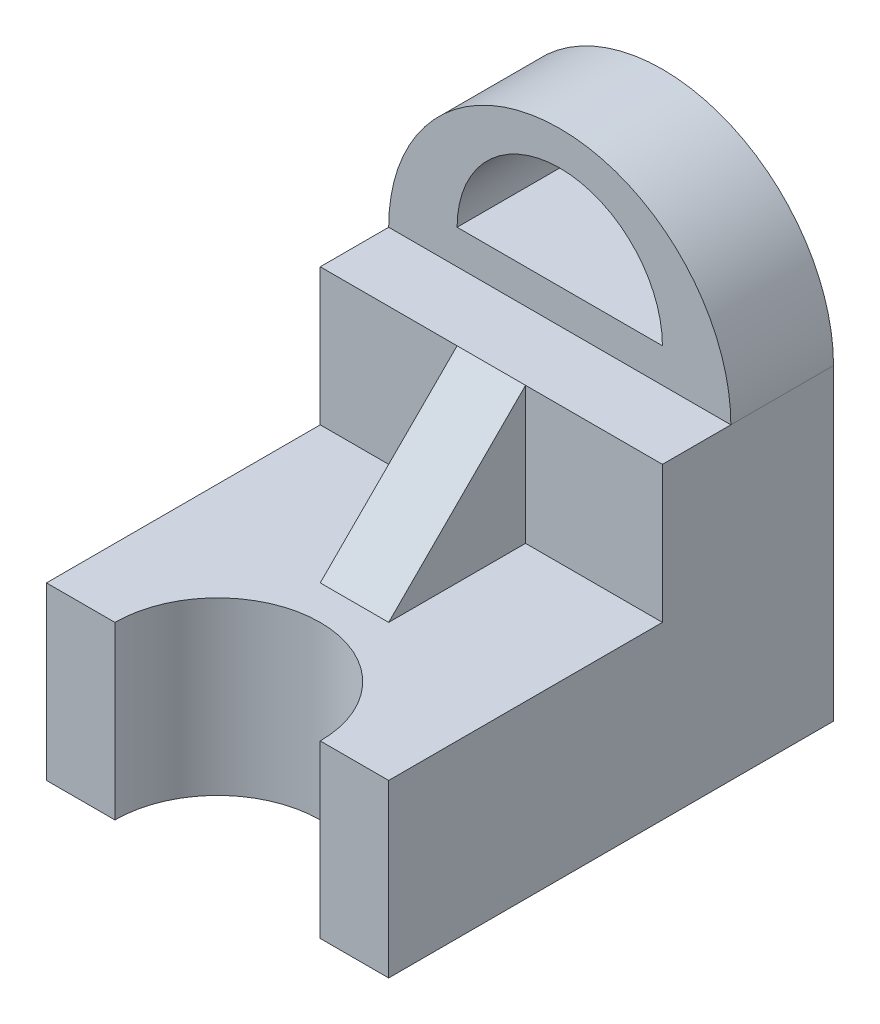
ISO-10303-21;
HEADER;
FILE_DESCRIPTION(('STEP AP214'),'2;1');
FILE_NAME('part.step','',(''),(''),'','','');
FILE_SCHEMA(('AUTOMOTIVE_DESIGN { 1 0 10303 214 1 1 1 1 }'));
ENDSEC;
DATA;
#1=APPLICATION_CONTEXT('core data for automotive mechanical design processes');
#2=APPLICATION_PROTOCOL_DEFINITION('international standard','automotive_design',2000,#1);
#3=PRODUCT_CONTEXT('',#1,'mechanical');
#4=PRODUCT('Part','Part','',(#3));
#5=PRODUCT_RELATED_PRODUCT_CATEGORY('part','',(#4));
#6=PRODUCT_DEFINITION_FORMATION('','',#4);
#7=PRODUCT_DEFINITION_CONTEXT('part definition',#1,'design');
#8=PRODUCT_DEFINITION('design','',#6,#7);
#9=PRODUCT_DEFINITION_SHAPE('','',#8);
#10=(LENGTH_UNIT() NAMED_UNIT(*) SI_UNIT(.MILLI.,.METRE.));
#11=(NAMED_UNIT(*) PLANE_ANGLE_UNIT() SI_UNIT($,.RADIAN.));
#12=(NAMED_UNIT(*) SI_UNIT($,.STERADIAN.) SOLID_ANGLE_UNIT());
#13=UNCERTAINTY_MEASURE_WITH_UNIT(LENGTH_MEASURE(1.E-05),#10,'distance_accuracy_value','');
#14=(GEOMETRIC_REPRESENTATION_CONTEXT(3) GLOBAL_UNCERTAINTY_ASSIGNED_CONTEXT((#13)) GLOBAL_UNIT_ASSIGNED_CONTEXT((#10,
#11,#12)) REPRESENTATION_CONTEXT('',''));
#15=CARTESIAN_POINT('',(0.,0.,0.));
#16=DIRECTION('',(0.,0.,1.));
#17=DIRECTION('',(1.,0.,0.));
#18=AXIS2_PLACEMENT_3D('',#15,#16,#17);
#19=CARTESIAN_POINT('',(0.,45.,117.));
#20=DIRECTION('',(0.,-1.,0.));
#21=DIRECTION('',(0.,0.,-1.));
#22=AXIS2_PLACEMENT_3D('',#19,#20,#21);
#23=PLANE('',#22);
#24=DIRECTION('',(0.,0.,-1.));
#25=VECTOR('',#24,1.);
#26=CARTESIAN_POINT('',(9.,45.,81.));
#27=LINE('',#26,#25);
#28=CARTESIAN_POINT('',(9.,45.,81.));
#29=VERTEX_POINT('',#28);
#30=CARTESIAN_POINT('',(9.,45.,45.));
#31=VERTEX_POINT('',#30);
#32=EDGE_CURVE('E50',#29,#31,#27,.T.);
#33=ORIENTED_EDGE('',*,*,#32,.F.);
#34=DIRECTION('',(-1.,0.,0.));
#35=VECTOR('',#34,1.);
#36=CARTESIAN_POINT('',(9.,45.,81.));
#37=LINE('',#36,#35);
#38=CARTESIAN_POINT('',(-9.,45.,81.));
#39=VERTEX_POINT('',#38);
#40=EDGE_CURVE('E55',#29,#39,#37,.T.);
#41=ORIENTED_EDGE('',*,*,#40,.T.);
#42=DIRECTION('',(0.,0.,-1.));
#43=VECTOR('',#42,1.);
#44=CARTESIAN_POINT('',(-9.,45.,81.));
#45=LINE('',#44,#43);
#46=CARTESIAN_POINT('',(-9.,45.,45.));
#47=VERTEX_POINT('',#46);
#48=EDGE_CURVE('E147',#39,#47,#45,.T.);
#49=ORIENTED_EDGE('',*,*,#48,.T.);
#50=DIRECTION('',(-1.,0.,0.));
#51=VECTOR('',#50,1.);
#52=CARTESIAN_POINT('',(0.,45.,45.));
#53=LINE('',#52,#51);
#54=CARTESIAN_POINT('',(-45.,45.,45.));
#55=VERTEX_POINT('',#54);
#56=EDGE_CURVE('E135',#47,#55,#53,.T.);
#57=ORIENTED_EDGE('',*,*,#56,.T.);
#58=DIRECTION('',(0.,0.,-1.));
#59=VECTOR('',#58,1.);
#60=CARTESIAN_POINT('',(-45.,45.,117.));
#61=LINE('',#60,#59);
#62=CARTESIAN_POINT('',(-45.,45.,117.));
#63=VERTEX_POINT('',#62);
#64=EDGE_CURVE('E231',#63,#55,#61,.T.);
#65=ORIENTED_EDGE('',*,*,#64,.F.);
#66=DIRECTION('',(-1.,0.,0.));
#67=VECTOR('',#66,1.);
#68=CARTESIAN_POINT('',(0.,45.,117.));
#69=LINE('',#68,#67);
#70=CARTESIAN_POINT('',(-27.,45.,117.));
#71=VERTEX_POINT('',#70);
#72=EDGE_CURVE('E227',#71,#63,#69,.T.);
#73=ORIENTED_EDGE('',*,*,#72,.F.);
#74=CARTESIAN_POINT('',(0.,45.,117.));
#75=DIRECTION('',(0.,1.,0.));
#76=DIRECTION('',(0.,0.,-1.));
#77=AXIS2_PLACEMENT_3D('',#74,#75,#76);
#78=CIRCLE('',#77,27.);
#79=CARTESIAN_POINT('',(27.,45.,117.));
#80=VERTEX_POINT('',#79);
#81=EDGE_CURVE('E166',#80,#71,#78,.T.);
#82=ORIENTED_EDGE('',*,*,#81,.F.);
#83=CARTESIAN_POINT('',(45.,45.,117.));
#84=VERTEX_POINT('',#83);
#85=EDGE_CURVE('E228',#84,#80,#69,.T.);
#86=ORIENTED_EDGE('',*,*,#85,.F.);
#87=DIRECTION('',(0.,0.,-1.));
#88=VECTOR('',#87,1.);
#89=CARTESIAN_POINT('',(45.,45.,117.));
#90=LINE('',#89,#88);
#91=CARTESIAN_POINT('',(45.,45.,45.));
#92=VERTEX_POINT('',#91);
#93=EDGE_CURVE('E238',#84,#92,#90,.T.);
#94=ORIENTED_EDGE('',*,*,#93,.T.);
#95=EDGE_CURVE('E144',#92,#31,#53,.T.);
#96=ORIENTED_EDGE('',*,*,#95,.T.);
#97=EDGE_LOOP('',(#33,#41,#49,#57,#65,#73,#82,#86,#94,#96));
#98=FACE_BOUND('',#97,.T.);
#99=ADVANCED_FACE('F35',(#98),#23,.F.);
#100=CARTESIAN_POINT('',(0.,0.,45.));
#101=DIRECTION('',(0.,0.,1.));
#102=DIRECTION('',(1.,0.,0.));
#103=AXIS2_PLACEMENT_3D('',#100,#101,#102);
#104=PLANE('',#103);
#105=DIRECTION('',(-1.,0.,0.));
#106=VECTOR('',#105,1.);
#107=CARTESIAN_POINT('',(0.,81.,45.));
#108=LINE('',#107,#106);
#109=CARTESIAN_POINT('',(45.,81.,45.));
#110=VERTEX_POINT('',#109);
#111=CARTESIAN_POINT('',(9.,81.,45.));
#112=VERTEX_POINT('',#111);
#113=EDGE_CURVE('E207',#110,#112,#108,.T.);
#114=ORIENTED_EDGE('',*,*,#113,.T.);
#115=DIRECTION('',(0.,1.,0.));
#116=VECTOR('',#115,1.);
#117=CARTESIAN_POINT('',(9.,45.,45.));
#118=LINE('',#117,#116);
#119=EDGE_CURVE('E150',#31,#112,#118,.T.);
#120=ORIENTED_EDGE('',*,*,#119,.F.);
#121=ORIENTED_EDGE('',*,*,#95,.F.);
#122=DIRECTION('',(0.,1.,0.));
#123=VECTOR('',#122,1.);
#124=CARTESIAN_POINT('',(45.,0.,45.));
#125=LINE('',#124,#123);
#126=EDGE_CURVE('E204',#92,#110,#125,.T.);
#127=ORIENTED_EDGE('',*,*,#126,.T.);
#128=EDGE_LOOP('',(#114,#120,#121,#127));
#129=FACE_BOUND('',#128,.T.);
#130=ADVANCED_FACE('F270',(#129),#104,.T.);
#131=CARTESIAN_POINT('',(0.,0.,117.));
#132=DIRECTION('',(0.,0.,1.));
#133=DIRECTION('',(1.,0.,0.));
#134=AXIS2_PLACEMENT_3D('',#131,#132,#133);
#135=PLANE('',#134);
#136=DIRECTION('',(0.,1.,0.));
#137=VECTOR('',#136,1.);
#138=CARTESIAN_POINT('',(27.,-0.001000000000001,117.));
#139=LINE('',#138,#137);
#140=CARTESIAN_POINT('',(27.,0.,117.));
#141=VERTEX_POINT('',#140);
#142=EDGE_CURVE('E169',#141,#80,#139,.T.);
#143=ORIENTED_EDGE('',*,*,#142,.F.);
#144=DIRECTION('',(-1.,0.,0.));
#145=VECTOR('',#144,1.);
#146=CARTESIAN_POINT('',(0.,0.,117.));
#147=LINE('',#146,#145);
#148=CARTESIAN_POINT('',(45.,0.,117.));
#149=VERTEX_POINT('',#148);
#150=EDGE_CURVE('E222',#149,#141,#147,.T.);
#151=ORIENTED_EDGE('',*,*,#150,.F.);
#152=DIRECTION('',(0.,1.,0.));
#153=VECTOR('',#152,1.);
#154=CARTESIAN_POINT('',(45.,0.,117.));
#155=LINE('',#154,#153);
#156=EDGE_CURVE('E225',#149,#84,#155,.T.);
#157=ORIENTED_EDGE('',*,*,#156,.T.);
#158=ORIENTED_EDGE('',*,*,#85,.T.);
#159=EDGE_LOOP('',(#143,#151,#157,#158));
#160=FACE_BOUND('',#159,.T.);
#161=ADVANCED_FACE('F293',(#160),#135,.T.);
#162=CARTESIAN_POINT('',(-45.,0.,117.));
#163=DIRECTION('',(-1.,0.,0.));
#164=DIRECTION('',(0.,0.,1.));
#165=AXIS2_PLACEMENT_3D('',#162,#163,#164);
#166=PLANE('',#165);
#167=DIRECTION('',(0.,1.,0.));
#168=VECTOR('',#167,1.);
#169=CARTESIAN_POINT('',(-45.,0.,0.));
#170=LINE('',#169,#168);
#171=CARTESIAN_POINT('',(-45.,0.,0.));
#172=VERTEX_POINT('',#171);
#173=CARTESIAN_POINT('',(-45.,81.,0.));
#174=VERTEX_POINT('',#173);
#175=EDGE_CURVE('E216',#172,#174,#170,.T.);
#176=ORIENTED_EDGE('',*,*,#175,.F.);
#177=DIRECTION('',(0.,0.,-1.));
#178=VECTOR('',#177,1.);
#179=CARTESIAN_POINT('',(-45.,0.,117.));
#180=LINE('',#179,#178);
#181=CARTESIAN_POINT('',(-45.,0.,117.));
#182=VERTEX_POINT('',#181);
#183=EDGE_CURVE('E11',#182,#172,#180,.T.);
#184=ORIENTED_EDGE('',*,*,#183,.F.);
#185=DIRECTION('',(0.,1.,0.));
#186=VECTOR('',#185,1.);
#187=CARTESIAN_POINT('',(-45.,0.,117.));
#188=LINE('',#187,#186);
#189=EDGE_CURVE('E217',#182,#63,#188,.T.);
#190=ORIENTED_EDGE('',*,*,#189,.T.);
#191=ORIENTED_EDGE('',*,*,#64,.T.);
#192=DIRECTION('',(0.,1.,0.));
#193=VECTOR('',#192,1.);
#194=CARTESIAN_POINT('',(-45.,0.,45.));
#195=LINE('',#194,#193);
#196=CARTESIAN_POINT('',(-45.,81.,45.));
#197=VERTEX_POINT('',#196);
#198=EDGE_CURVE('E141',#55,#197,#195,.T.);
#199=ORIENTED_EDGE('',*,*,#198,.T.);
#200=DIRECTION('',(0.,0.,-1.));
#201=VECTOR('',#200,1.);
#202=CARTESIAN_POINT('',(-45.,81.,45.));
#203=LINE('',#202,#201);
#204=CARTESIAN_POINT('',(-45.,81.,27.));
#205=VERTEX_POINT('',#204);
#206=EDGE_CURVE('E210',#197,#205,#203,.T.);
#207=ORIENTED_EDGE('',*,*,#206,.T.);
#208=DIRECTION('',(0.,0.,-1.));
#209=VECTOR('',#208,1.);
#210=CARTESIAN_POINT('',(-45.,81.,27.));
#211=LINE('',#210,#209);
#212=EDGE_CURVE('E196',#205,#174,#211,.T.);
#213=ORIENTED_EDGE('',*,*,#212,.T.);
#214=EDGE_LOOP('',(#176,#184,#190,#191,#199,#207,#213));
#215=FACE_BOUND('',#214,.T.);
#216=ADVANCED_FACE('F37',(#215),#166,.T.);
#217=CARTESIAN_POINT('',(0.,0.,117.));
#218=DIRECTION('',(0.,-1.,0.));
#219=DIRECTION('',(1.,0.,0.));
#220=AXIS2_PLACEMENT_3D('',#217,#218,#219);
#221=PLANE('',#220);
#222=CARTESIAN_POINT('',(0.,0.,117.));
#223=DIRECTION('',(0.,-1.,0.));
#224=DIRECTION('',(1.,0.,0.));
#225=AXIS2_PLACEMENT_3D('',#222,#223,#224);
#226=CIRCLE('',#225,27.);
#227=CARTESIAN_POINT('',(-27.,0.,117.));
#228=VERTEX_POINT('',#227);
#229=EDGE_CURVE('E163',#141,#228,#226,.F.);
#230=ORIENTED_EDGE('',*,*,#229,.T.);
#231=EDGE_CURVE('E220',#228,#182,#147,.T.);
#232=ORIENTED_EDGE('',*,*,#231,.T.);
#233=ORIENTED_EDGE('',*,*,#183,.T.);
#234=DIRECTION('',(-1.,0.,0.));
#235=VECTOR('',#234,1.);
#236=CARTESIAN_POINT('',(0.,0.,0.));
#237=LINE('',#236,#235);
#238=CARTESIAN_POINT('',(45.,0.,0.));
#239=VERTEX_POINT('',#238);
#240=EDGE_CURVE('E233',#239,#172,#237,.T.);
#241=ORIENTED_EDGE('',*,*,#240,.F.);
#242=DIRECTION('',(0.,0.,-1.));
#243=VECTOR('',#242,1.);
#244=CARTESIAN_POINT('',(45.,0.,117.));
#245=LINE('',#244,#243);
#246=EDGE_CURVE('E43',#149,#239,#245,.T.);
#247=ORIENTED_EDGE('',*,*,#246,.F.);
#248=ORIENTED_EDGE('',*,*,#150,.T.);
#249=EDGE_LOOP('',(#230,#232,#233,#241,#247,#248));
#250=FACE_BOUND('',#249,.T.);
#251=ADVANCED_FACE('F252',(#250),#221,.T.);
#252=CARTESIAN_POINT('',(45.,0.,117.));
#253=DIRECTION('',(-1.,0.,0.));
#254=DIRECTION('',(0.,0.,1.));
#255=AXIS2_PLACEMENT_3D('',#252,#253,#254);
#256=PLANE('',#255);
#257=DIRECTION('',(0.,1.,0.));
#258=VECTOR('',#257,1.);
#259=CARTESIAN_POINT('',(45.,0.,0.));
#260=LINE('',#259,#258);
#261=CARTESIAN_POINT('',(45.,81.,0.));
#262=VERTEX_POINT('',#261);
#263=EDGE_CURVE('E221',#239,#262,#260,.T.);
#264=ORIENTED_EDGE('',*,*,#263,.T.);
#265=DIRECTION('',(0.,0.,-1.));
#266=VECTOR('',#265,1.);
#267=CARTESIAN_POINT('',(45.,81.,27.));
#268=LINE('',#267,#266);
#269=CARTESIAN_POINT('',(45.,81.,27.));
#270=VERTEX_POINT('',#269);
#271=EDGE_CURVE('E185',#270,#262,#268,.T.);
#272=ORIENTED_EDGE('',*,*,#271,.F.);
#273=DIRECTION('',(0.,0.,-1.));
#274=VECTOR('',#273,1.);
#275=CARTESIAN_POINT('',(45.,81.,45.));
#276=LINE('',#275,#274);
#277=EDGE_CURVE('E213',#110,#270,#276,.T.);
#278=ORIENTED_EDGE('',*,*,#277,.F.);
#279=ORIENTED_EDGE('',*,*,#126,.F.);
#280=ORIENTED_EDGE('',*,*,#93,.F.);
#281=ORIENTED_EDGE('',*,*,#156,.F.);
#282=ORIENTED_EDGE('',*,*,#246,.T.);
#283=EDGE_LOOP('',(#264,#272,#278,#279,#280,#281,#282));
#284=FACE_BOUND('',#283,.T.);
#285=ADVANCED_FACE('F243',(#284),#256,.F.);
#286=DIRECTION('',(0.,1.,0.));
#287=VECTOR('',#286,1.);
#288=CARTESIAN_POINT('',(-27.,-0.001000000000001,117.));
#289=LINE('',#288,#287);
#290=EDGE_CURVE('E168',#228,#71,#289,.T.);
#291=ORIENTED_EDGE('',*,*,#290,.T.);
#292=ORIENTED_EDGE('',*,*,#72,.T.);
#293=ORIENTED_EDGE('',*,*,#189,.F.);
#294=ORIENTED_EDGE('',*,*,#231,.F.);
#295=EDGE_LOOP('',(#291,#292,#293,#294));
#296=FACE_BOUND('',#295,.T.);
#297=ADVANCED_FACE('F299',(#296),#135,.T.);
#298=CARTESIAN_POINT('',(0.,0.,0.));
#299=DIRECTION('',(0.,0.,1.));
#300=DIRECTION('',(1.,0.,0.));
#301=AXIS2_PLACEMENT_3D('',#298,#299,#300);
#302=PLANE('',#301);
#303=ORIENTED_EDGE('',*,*,#175,.T.);
#304=CARTESIAN_POINT('',(0.,81.,0.));
#305=DIRECTION('',(0.,0.,1.));
#306=DIRECTION('',(1.,0.,0.));
#307=AXIS2_PLACEMENT_3D('',#304,#305,#306);
#308=CIRCLE('',#307,45.);
#309=EDGE_CURVE('E171',#174,#262,#308,.F.);
#310=ORIENTED_EDGE('',*,*,#309,.T.);
#311=ORIENTED_EDGE('',*,*,#263,.F.);
#312=ORIENTED_EDGE('',*,*,#240,.T.);
#313=EDGE_LOOP('',(#303,#310,#311,#312));
#314=FACE_BOUND('',#313,.T.);
#315=DIRECTION('',(-1.,0.,0.));
#316=VECTOR('',#315,1.);
#317=CARTESIAN_POINT('',(0.,90.,0.));
#318=LINE('',#317,#316);
#319=CARTESIAN_POINT('',(27.,90.,0.));
#320=VERTEX_POINT('',#319);
#321=CARTESIAN_POINT('',(-27.,90.,0.));
#322=VERTEX_POINT('',#321);
#323=EDGE_CURVE('E188',#320,#322,#318,.T.);
#324=ORIENTED_EDGE('',*,*,#323,.F.);
#325=CARTESIAN_POINT('',(0.,90.,0.));
#326=DIRECTION('',(0.,0.,1.));
#327=DIRECTION('',(1.,0.,0.));
#328=AXIS2_PLACEMENT_3D('',#325,#326,#327);
#329=CIRCLE('',#328,27.);
#330=EDGE_CURVE('E178',#322,#320,#329,.F.);
#331=ORIENTED_EDGE('',*,*,#330,.F.);
#332=EDGE_LOOP('',(#324,#331));
#333=FACE_BOUND('',#332,.T.);
#334=ADVANCED_FACE('F249',(#314,#333),#302,.F.);
#335=CARTESIAN_POINT('',(0.,81.,45.));
#336=DIRECTION('',(0.,-1.,0.));
#337=DIRECTION('',(0.,0.,-1.));
#338=AXIS2_PLACEMENT_3D('',#335,#336,#337);
#339=PLANE('',#338);
#340=ORIENTED_EDGE('',*,*,#277,.T.);
#341=DIRECTION('',(-1.,0.,0.));
#342=VECTOR('',#341,1.);
#343=CARTESIAN_POINT('',(0.,81.,27.));
#344=LINE('',#343,#342);
#345=EDGE_CURVE('E177',#270,#205,#344,.T.);
#346=ORIENTED_EDGE('',*,*,#345,.T.);
#347=ORIENTED_EDGE('',*,*,#206,.F.);
#348=CARTESIAN_POINT('',(-9.,81.,45.));
#349=VERTEX_POINT('',#348);
#350=EDGE_CURVE('E206',#349,#197,#108,.T.);
#351=ORIENTED_EDGE('',*,*,#350,.F.);
#352=DIRECTION('',(-1.,0.,0.));
#353=VECTOR('',#352,1.);
#354=CARTESIAN_POINT('',(9.,81.,45.));
#355=LINE('',#354,#353);
#356=EDGE_CURVE('E161',#112,#349,#355,.T.);
#357=ORIENTED_EDGE('',*,*,#356,.F.);
#358=ORIENTED_EDGE('',*,*,#113,.F.);
#359=EDGE_LOOP('',(#340,#346,#347,#351,#357,#358));
#360=FACE_BOUND('',#359,.T.);
#361=ADVANCED_FACE('F267',(#360),#339,.F.);
#362=DIRECTION('',(0.,1.,0.));
#363=VECTOR('',#362,1.);
#364=CARTESIAN_POINT('',(-9.,45.,45.));
#365=LINE('',#364,#363);
#366=EDGE_CURVE('E138',#47,#349,#365,.T.);
#367=ORIENTED_EDGE('',*,*,#366,.T.);
#368=ORIENTED_EDGE('',*,*,#350,.T.);
#369=ORIENTED_EDGE('',*,*,#198,.F.);
#370=ORIENTED_EDGE('',*,*,#56,.F.);
#371=EDGE_LOOP('',(#367,#368,#369,#370));
#372=FACE_BOUND('',#371,.T.);
#373=ADVANCED_FACE('F136',(#372),#104,.T.);
#374=CARTESIAN_POINT('',(0.,90.,27.));
#375=DIRECTION('',(0.,-1.,0.));
#376=DIRECTION('',(0.,0.,-1.));
#377=AXIS2_PLACEMENT_3D('',#374,#375,#376);
#378=PLANE('',#377);
#379=ORIENTED_EDGE('',*,*,#323,.T.);
#380=DIRECTION('',(0.,0.,-1.));
#381=VECTOR('',#380,1.);
#382=CARTESIAN_POINT('',(-27.,90.,27.));
#383=LINE('',#382,#381);
#384=CARTESIAN_POINT('',(-27.,90.,27.));
#385=VERTEX_POINT('',#384);
#386=EDGE_CURVE('E195',#385,#322,#383,.T.);
#387=ORIENTED_EDGE('',*,*,#386,.F.);
#388=DIRECTION('',(-1.,0.,0.));
#389=VECTOR('',#388,1.);
#390=CARTESIAN_POINT('',(0.,90.,27.));
#391=LINE('',#390,#389);
#392=CARTESIAN_POINT('',(27.,90.,27.));
#393=VERTEX_POINT('',#392);
#394=EDGE_CURVE('E180',#393,#385,#391,.T.);
#395=ORIENTED_EDGE('',*,*,#394,.F.);
#396=DIRECTION('',(0.,0.,-1.));
#397=VECTOR('',#396,1.);
#398=CARTESIAN_POINT('',(27.,90.,27.));
#399=LINE('',#398,#397);
#400=EDGE_CURVE('E192',#393,#320,#399,.T.);
#401=ORIENTED_EDGE('',*,*,#400,.T.);
#402=EDGE_LOOP('',(#379,#387,#395,#401));
#403=FACE_BOUND('',#402,.T.);
#404=ADVANCED_FACE('F334',(#403),#378,.F.);
#405=CARTESIAN_POINT('',(0.,81.,27.));
#406=DIRECTION('',(0.,0.,-1.));
#407=DIRECTION('',(-1.,0.,0.));
#408=AXIS2_PLACEMENT_3D('',#405,#406,#407);
#409=CYLINDRICAL_SURFACE('',#408,45.);
#410=ORIENTED_EDGE('',*,*,#309,.F.);
#411=ORIENTED_EDGE('',*,*,#212,.F.);
#412=CARTESIAN_POINT('',(0.,81.,27.));
#413=DIRECTION('',(0.,0.,1.));
#414=DIRECTION('',(1.,0.,0.));
#415=AXIS2_PLACEMENT_3D('',#412,#413,#414);
#416=CIRCLE('',#415,45.);
#417=EDGE_CURVE('E174',#205,#270,#416,.F.);
#418=ORIENTED_EDGE('',*,*,#417,.T.);
#419=ORIENTED_EDGE('',*,*,#271,.T.);
#420=EDGE_LOOP('',(#410,#411,#418,#419));
#421=FACE_BOUND('',#420,.T.);
#422=ADVANCED_FACE('F262',(#421),#409,.T.);
#423=CARTESIAN_POINT('',(0.,90.,27.));
#424=DIRECTION('',(0.,0.,-1.));
#425=DIRECTION('',(-1.,0.,0.));
#426=AXIS2_PLACEMENT_3D('',#423,#424,#425);
#427=CYLINDRICAL_SURFACE('',#426,27.);
#428=ORIENTED_EDGE('',*,*,#330,.T.);
#429=ORIENTED_EDGE('',*,*,#400,.F.);
#430=CARTESIAN_POINT('',(0.,90.,27.));
#431=DIRECTION('',(0.,0.,1.));
#432=DIRECTION('',(1.,0.,0.));
#433=AXIS2_PLACEMENT_3D('',#430,#431,#432);
#434=CIRCLE('',#433,27.);
#435=EDGE_CURVE('E183',#385,#393,#434,.F.);
#436=ORIENTED_EDGE('',*,*,#435,.F.);
#437=ORIENTED_EDGE('',*,*,#386,.T.);
#438=EDGE_LOOP('',(#428,#429,#436,#437));
#439=FACE_BOUND('',#438,.T.);
#440=ADVANCED_FACE('F327',(#439),#427,.F.);
#441=CARTESIAN_POINT('',(0.,0.,27.));
#442=DIRECTION('',(0.,0.,1.));
#443=DIRECTION('',(1.,0.,0.));
#444=AXIS2_PLACEMENT_3D('',#441,#442,#443);
#445=PLANE('',#444);
#446=ORIENTED_EDGE('',*,*,#417,.F.);
#447=ORIENTED_EDGE('',*,*,#345,.F.);
#448=EDGE_LOOP('',(#446,#447));
#449=FACE_BOUND('',#448,.T.);
#450=ORIENTED_EDGE('',*,*,#394,.T.);
#451=ORIENTED_EDGE('',*,*,#435,.T.);
#452=EDGE_LOOP('',(#450,#451));
#453=FACE_BOUND('',#452,.T.);
#454=ADVANCED_FACE('F322',(#449,#453),#445,.T.);
#455=CARTESIAN_POINT('',(0.,-0.001000000000001,117.));
#456=DIRECTION('',(0.,1.,0.));
#457=DIRECTION('',(0.,0.,1.));
#458=AXIS2_PLACEMENT_3D('',#455,#456,#457);
#459=CYLINDRICAL_SURFACE('',#458,27.);
#460=ORIENTED_EDGE('',*,*,#142,.T.);
#461=ORIENTED_EDGE('',*,*,#81,.T.);
#462=ORIENTED_EDGE('',*,*,#290,.F.);
#463=ORIENTED_EDGE('',*,*,#229,.F.);
#464=EDGE_LOOP('',(#460,#461,#462,#463));
#465=FACE_BOUND('',#464,.T.);
#466=ADVANCED_FACE('F286',(#465),#459,.F.);
#467=CARTESIAN_POINT('',(9.,81.,45.));
#468=DIRECTION('',(0.,-0.707106781186548,-0.707106781186547));
#469=DIRECTION('',(0.,0.707106781186547,-0.707106781186548));
#470=AXIS2_PLACEMENT_3D('',#467,#468,#469);
#471=PLANE('',#470);
#472=DIRECTION('',(0.,-0.707106781186547,0.707106781186548));
#473=VECTOR('',#472,1.);
#474=CARTESIAN_POINT('',(-9.,81.,45.));
#475=LINE('',#474,#473);
#476=EDGE_CURVE('E151',#349,#39,#475,.T.);
#477=ORIENTED_EDGE('',*,*,#476,.T.);
#478=ORIENTED_EDGE('',*,*,#40,.F.);
#479=DIRECTION('',(0.,-0.707106781186547,0.707106781186548));
#480=VECTOR('',#479,1.);
#481=CARTESIAN_POINT('',(9.,81.,45.));
#482=LINE('',#481,#480);
#483=EDGE_CURVE('E274',#112,#29,#482,.T.);
#484=ORIENTED_EDGE('',*,*,#483,.F.);
#485=ORIENTED_EDGE('',*,*,#356,.T.);
#486=EDGE_LOOP('',(#477,#478,#484,#485));
#487=FACE_BOUND('',#486,.T.);
#488=ADVANCED_FACE('F275',(#487),#471,.F.);
#489=CARTESIAN_POINT('',(9.,0.,0.));
#490=DIRECTION('',(-1.,0.,0.));
#491=DIRECTION('',(0.,0.,1.));
#492=AXIS2_PLACEMENT_3D('',#489,#490,#491);
#493=PLANE('',#492);
#494=ORIENTED_EDGE('',*,*,#119,.T.);
#495=ORIENTED_EDGE('',*,*,#483,.T.);
#496=ORIENTED_EDGE('',*,*,#32,.T.);
#497=EDGE_LOOP('',(#494,#495,#496));
#498=FACE_BOUND('',#497,.T.);
#499=ADVANCED_FACE('F277',(#498),#493,.F.);
#500=CARTESIAN_POINT('',(-9.,0.,0.));
#501=DIRECTION('',(-1.,0.,0.));
#502=DIRECTION('',(0.,0.,1.));
#503=AXIS2_PLACEMENT_3D('',#500,#501,#502);
#504=PLANE('',#503);
#505=ORIENTED_EDGE('',*,*,#366,.F.);
#506=ORIENTED_EDGE('',*,*,#48,.F.);
#507=ORIENTED_EDGE('',*,*,#476,.F.);
#508=EDGE_LOOP('',(#505,#506,#507));
#509=FACE_BOUND('',#508,.T.);
#510=ADVANCED_FACE('F153',(#509),#504,.T.);
#511=CLOSED_SHELL('',(#99,#130,#161,#216,#251,#285,#297,#334,#361,#373,#404,#422,#440,#454,#466,
#488,#499,#510));
#512=MANIFOLD_SOLID_BREP('B2',#511);
#513=ADVANCED_BREP_SHAPE_REPRESENTATION('',(#18,#512),#14);
#514=SHAPE_DEFINITION_REPRESENTATION(#9,#513);
ENDSEC;
END-ISO-10303-21;
